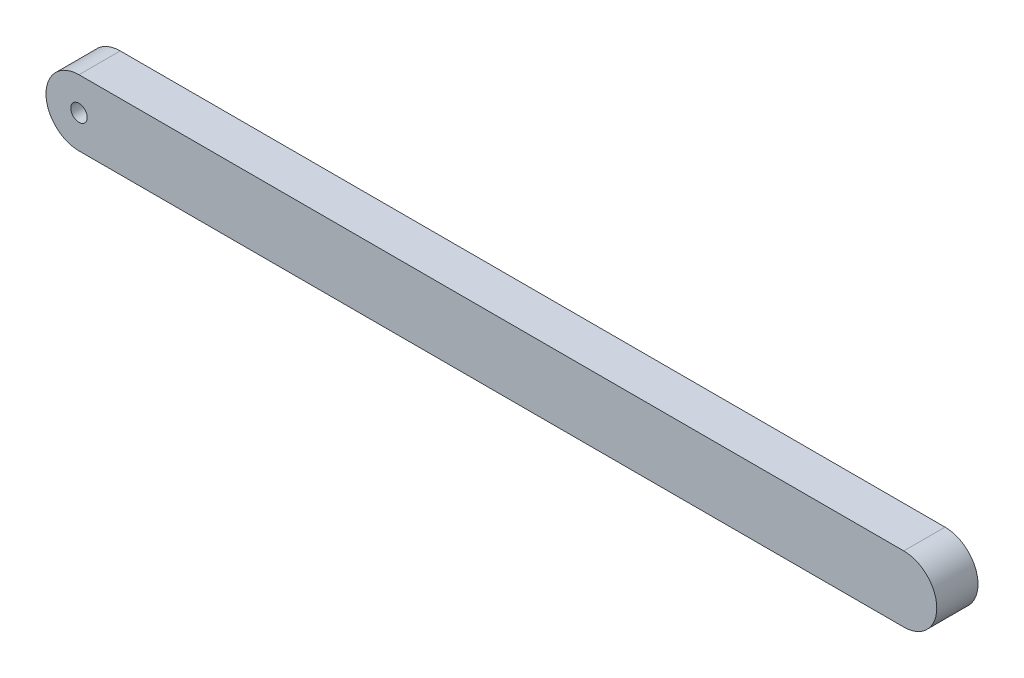
ISO-10303-21;
HEADER;
FILE_DESCRIPTION(('STEP AP214'),'2;1');
FILE_NAME('part.step','',(''),(''),'','','');
FILE_SCHEMA(('AUTOMOTIVE_DESIGN { 1 0 10303 214 1 1 1 1 }'));
ENDSEC;
DATA;
#1=APPLICATION_CONTEXT('core data for automotive mechanical design processes');
#2=APPLICATION_PROTOCOL_DEFINITION('international standard','automotive_design',2000,#1);
#3=PRODUCT_CONTEXT('',#1,'mechanical');
#4=PRODUCT('Part','Part','',(#3));
#5=PRODUCT_RELATED_PRODUCT_CATEGORY('part','',(#4));
#6=PRODUCT_DEFINITION_FORMATION('','',#4);
#7=PRODUCT_DEFINITION_CONTEXT('part definition',#1,'design');
#8=PRODUCT_DEFINITION('design','',#6,#7);
#9=PRODUCT_DEFINITION_SHAPE('','',#8);
#10=(LENGTH_UNIT() NAMED_UNIT(*) SI_UNIT(.MILLI.,.METRE.));
#11=(NAMED_UNIT(*) PLANE_ANGLE_UNIT() SI_UNIT($,.RADIAN.));
#12=(NAMED_UNIT(*) SI_UNIT($,.STERADIAN.) SOLID_ANGLE_UNIT());
#13=UNCERTAINTY_MEASURE_WITH_UNIT(LENGTH_MEASURE(1.E-05),#10,'distance_accuracy_value','');
#14=(GEOMETRIC_REPRESENTATION_CONTEXT(3) GLOBAL_UNCERTAINTY_ASSIGNED_CONTEXT((#13)) GLOBAL_UNIT_ASSIGNED_CONTEXT((#10,
#11,#12)) REPRESENTATION_CONTEXT('',''));
#15=CARTESIAN_POINT('',(0.,0.,0.));
#16=DIRECTION('',(0.,0.,1.));
#17=DIRECTION('',(1.,0.,0.));
#18=AXIS2_PLACEMENT_3D('',#15,#16,#17);
#19=CARTESIAN_POINT('',(0.,0.,-50.));
#20=DIRECTION('',(0.,0.,1.));
#21=DIRECTION('',(1.,0.,0.));
#22=AXIS2_PLACEMENT_3D('',#19,#20,#21);
#23=CYLINDRICAL_SURFACE('',#22,40.);
#24=CARTESIAN_POINT('',(0.,0.,0.));
#25=DIRECTION('',(0.,0.,1.));
#26=DIRECTION('',(1.,0.,0.));
#27=AXIS2_PLACEMENT_3D('',#24,#25,#26);
#28=CIRCLE('',#27,40.);
#29=CARTESIAN_POINT('',(0.,40.,0.));
#30=VERTEX_POINT('',#29);
#31=CARTESIAN_POINT('',(0.,-40.,0.));
#32=VERTEX_POINT('',#31);
#33=EDGE_CURVE('E114',#30,#32,#28,.T.);
#34=ORIENTED_EDGE('',*,*,#33,.F.);
#35=DIRECTION('',(0.,0.,1.));
#36=VECTOR('',#35,1.);
#37=CARTESIAN_POINT('',(0.,40.,-50.));
#38=LINE('',#37,#36);
#39=CARTESIAN_POINT('',(0.,40.,-50.));
#40=VERTEX_POINT('',#39);
#41=EDGE_CURVE('E11',#40,#30,#38,.T.);
#42=ORIENTED_EDGE('',*,*,#41,.F.);
#43=CARTESIAN_POINT('',(0.,0.,-50.));
#44=DIRECTION('',(0.,0.,1.));
#45=DIRECTION('',(1.,0.,0.));
#46=AXIS2_PLACEMENT_3D('',#43,#44,#45);
#47=CIRCLE('',#46,40.);
#48=CARTESIAN_POINT('',(0.,-40.,-50.));
#49=VERTEX_POINT('',#48);
#50=EDGE_CURVE('E103',#40,#49,#47,.T.);
#51=ORIENTED_EDGE('',*,*,#50,.T.);
#52=DIRECTION('',(0.,0.,1.));
#53=VECTOR('',#52,1.);
#54=CARTESIAN_POINT('',(0.,-40.,-50.));
#55=LINE('',#54,#53);
#56=EDGE_CURVE('E44',#49,#32,#55,.T.);
#57=ORIENTED_EDGE('',*,*,#56,.T.);
#58=EDGE_LOOP('',(#34,#42,#51,#57));
#59=FACE_BOUND('',#58,.T.);
#60=ADVANCED_FACE('F41',(#59),#23,.T.);
#61=CARTESIAN_POINT('',(0.,40.,-50.));
#62=DIRECTION('',(0.,1.,0.));
#63=DIRECTION('',(0.,0.,1.));
#64=AXIS2_PLACEMENT_3D('',#61,#62,#63);
#65=PLANE('',#64);
#66=DIRECTION('',(-1.,0.,0.));
#67=VECTOR('',#66,1.);
#68=CARTESIAN_POINT('',(0.,40.,0.));
#69=LINE('',#68,#67);
#70=CARTESIAN_POINT('',(1000.,40.,0.));
#71=VERTEX_POINT('',#70);
#72=EDGE_CURVE('E108',#71,#30,#69,.T.);
#73=ORIENTED_EDGE('',*,*,#72,.F.);
#74=DIRECTION('',(0.,0.,1.));
#75=VECTOR('',#74,1.);
#76=CARTESIAN_POINT('',(1000.,40.,-50.));
#77=LINE('',#76,#75);
#78=CARTESIAN_POINT('',(1000.,40.,-50.));
#79=VERTEX_POINT('',#78);
#80=EDGE_CURVE('E51',#79,#71,#77,.T.);
#81=ORIENTED_EDGE('',*,*,#80,.F.);
#82=DIRECTION('',(-1.,0.,0.));
#83=VECTOR('',#82,1.);
#84=CARTESIAN_POINT('',(0.,40.,-50.));
#85=LINE('',#84,#83);
#86=EDGE_CURVE('E98',#79,#40,#85,.T.);
#87=ORIENTED_EDGE('',*,*,#86,.T.);
#88=ORIENTED_EDGE('',*,*,#41,.T.);
#89=EDGE_LOOP('',(#73,#81,#87,#88));
#90=FACE_BOUND('',#89,.T.);
#91=ADVANCED_FACE('F132',(#90),#65,.T.);
#92=CARTESIAN_POINT('',(1000.,0.,-50.));
#93=DIRECTION('',(0.,0.,1.));
#94=DIRECTION('',(1.,0.,0.));
#95=AXIS2_PLACEMENT_3D('',#92,#93,#94);
#96=CYLINDRICAL_SURFACE('',#95,40.);
#97=CARTESIAN_POINT('',(1000.,0.,0.));
#98=DIRECTION('',(0.,0.,1.));
#99=DIRECTION('',(1.,0.,0.));
#100=AXIS2_PLACEMENT_3D('',#97,#98,#99);
#101=CIRCLE('',#100,40.);
#102=CARTESIAN_POINT('',(1000.,-40.,0.));
#103=VERTEX_POINT('',#102);
#104=EDGE_CURVE('E92',#103,#71,#101,.T.);
#105=ORIENTED_EDGE('',*,*,#104,.F.);
#106=DIRECTION('',(0.,0.,1.));
#107=VECTOR('',#106,1.);
#108=CARTESIAN_POINT('',(1000.,-40.,-50.));
#109=LINE('',#108,#107);
#110=CARTESIAN_POINT('',(1000.,-40.,-50.));
#111=VERTEX_POINT('',#110);
#112=EDGE_CURVE('E87',#111,#103,#109,.T.);
#113=ORIENTED_EDGE('',*,*,#112,.F.);
#114=CARTESIAN_POINT('',(1000.,0.,-50.));
#115=DIRECTION('',(0.,0.,1.));
#116=DIRECTION('',(1.,0.,0.));
#117=AXIS2_PLACEMENT_3D('',#114,#115,#116);
#118=CIRCLE('',#117,40.);
#119=EDGE_CURVE('E90',#111,#79,#118,.T.);
#120=ORIENTED_EDGE('',*,*,#119,.T.);
#121=ORIENTED_EDGE('',*,*,#80,.T.);
#122=EDGE_LOOP('',(#105,#113,#120,#121));
#123=FACE_BOUND('',#122,.T.);
#124=ADVANCED_FACE('F89',(#123),#96,.T.);
#125=CARTESIAN_POINT('',(0.,-40.,-50.));
#126=DIRECTION('',(0.,-1.,0.));
#127=DIRECTION('',(0.,0.,-1.));
#128=AXIS2_PLACEMENT_3D('',#125,#126,#127);
#129=PLANE('',#128);
#130=DIRECTION('',(1.,0.,0.));
#131=VECTOR('',#130,1.);
#132=CARTESIAN_POINT('',(0.,-40.,0.));
#133=LINE('',#132,#131);
#134=EDGE_CURVE('E118',#32,#103,#133,.T.);
#135=ORIENTED_EDGE('',*,*,#134,.F.);
#136=ORIENTED_EDGE('',*,*,#56,.F.);
#137=DIRECTION('',(1.,0.,0.));
#138=VECTOR('',#137,1.);
#139=CARTESIAN_POINT('',(0.,-40.,-50.));
#140=LINE('',#139,#138);
#141=EDGE_CURVE('E97',#49,#111,#140,.T.);
#142=ORIENTED_EDGE('',*,*,#141,.T.);
#143=ORIENTED_EDGE('',*,*,#112,.T.);
#144=EDGE_LOOP('',(#135,#136,#142,#143));
#145=FACE_BOUND('',#144,.T.);
#146=ADVANCED_FACE('F101',(#145),#129,.T.);
#147=CARTESIAN_POINT('',(0.,0.,-50.));
#148=DIRECTION('',(0.,0.,1.));
#149=DIRECTION('',(1.,0.,0.));
#150=AXIS2_PLACEMENT_3D('',#147,#148,#149);
#151=PLANE('',#150);
#152=CARTESIAN_POINT('',(0.,0.,-50.));
#153=DIRECTION('',(0.,0.,1.));
#154=DIRECTION('',(1.,0.,0.));
#155=AXIS2_PLACEMENT_3D('',#152,#153,#154);
#156=CIRCLE('',#155,10.);
#157=CARTESIAN_POINT('',(10.,0.,-50.));
#158=VERTEX_POINT('',#157);
#159=EDGE_CURVE('E119',#158,#158,#156,.T.);
#160=ORIENTED_EDGE('',*,*,#159,.T.);
#161=EDGE_LOOP('',(#160));
#162=FACE_BOUND('',#161,.T.);
#163=ORIENTED_EDGE('',*,*,#50,.F.);
#164=ORIENTED_EDGE('',*,*,#86,.F.);
#165=ORIENTED_EDGE('',*,*,#119,.F.);
#166=ORIENTED_EDGE('',*,*,#141,.F.);
#167=EDGE_LOOP('',(#163,#164,#165,#166));
#168=FACE_BOUND('',#167,.T.);
#169=ADVANCED_FACE('F96',(#162,#168),#151,.F.);
#170=CARTESIAN_POINT('',(0.,0.,0.));
#171=DIRECTION('',(0.,0.,1.));
#172=DIRECTION('',(1.,0.,0.));
#173=AXIS2_PLACEMENT_3D('',#170,#171,#172);
#174=PLANE('',#173);
#175=CARTESIAN_POINT('',(0.,0.,0.));
#176=DIRECTION('',(0.,0.,1.));
#177=DIRECTION('',(1.,0.,0.));
#178=AXIS2_PLACEMENT_3D('',#175,#176,#177);
#179=CIRCLE('',#178,10.);
#180=CARTESIAN_POINT('',(10.,0.,0.));
#181=VERTEX_POINT('',#180);
#182=EDGE_CURVE('E128',#181,#181,#179,.T.);
#183=ORIENTED_EDGE('',*,*,#182,.F.);
#184=EDGE_LOOP('',(#183));
#185=FACE_BOUND('',#184,.T.);
#186=ORIENTED_EDGE('',*,*,#33,.T.);
#187=ORIENTED_EDGE('',*,*,#134,.T.);
#188=ORIENTED_EDGE('',*,*,#104,.T.);
#189=ORIENTED_EDGE('',*,*,#72,.T.);
#190=EDGE_LOOP('',(#186,#187,#188,#189));
#191=FACE_BOUND('',#190,.T.);
#192=ADVANCED_FACE('F131',(#185,#191),#174,.T.);
#193=CARTESIAN_POINT('',(0.,0.,-50.));
#194=DIRECTION('',(0.,0.,1.));
#195=DIRECTION('',(1.,0.,0.));
#196=AXIS2_PLACEMENT_3D('',#193,#194,#195);
#197=CYLINDRICAL_SURFACE('',#196,10.);
#198=ORIENTED_EDGE('',*,*,#159,.F.);
#199=EDGE_LOOP('',(#198));
#200=FACE_BOUND('',#199,.T.);
#201=ORIENTED_EDGE('',*,*,#182,.T.);
#202=EDGE_LOOP('',(#201));
#203=FACE_BOUND('',#202,.T.);
#204=ADVANCED_FACE('F150',(#200,#203),#197,.F.);
#205=CLOSED_SHELL('',(#60,#91,#124,#146,#169,#192,#204));
#206=MANIFOLD_SOLID_BREP('B2',#205);
#207=ADVANCED_BREP_SHAPE_REPRESENTATION('',(#18,#206),#14);
#208=SHAPE_DEFINITION_REPRESENTATION(#9,#207);
ENDSEC;
END-ISO-10303-21;
